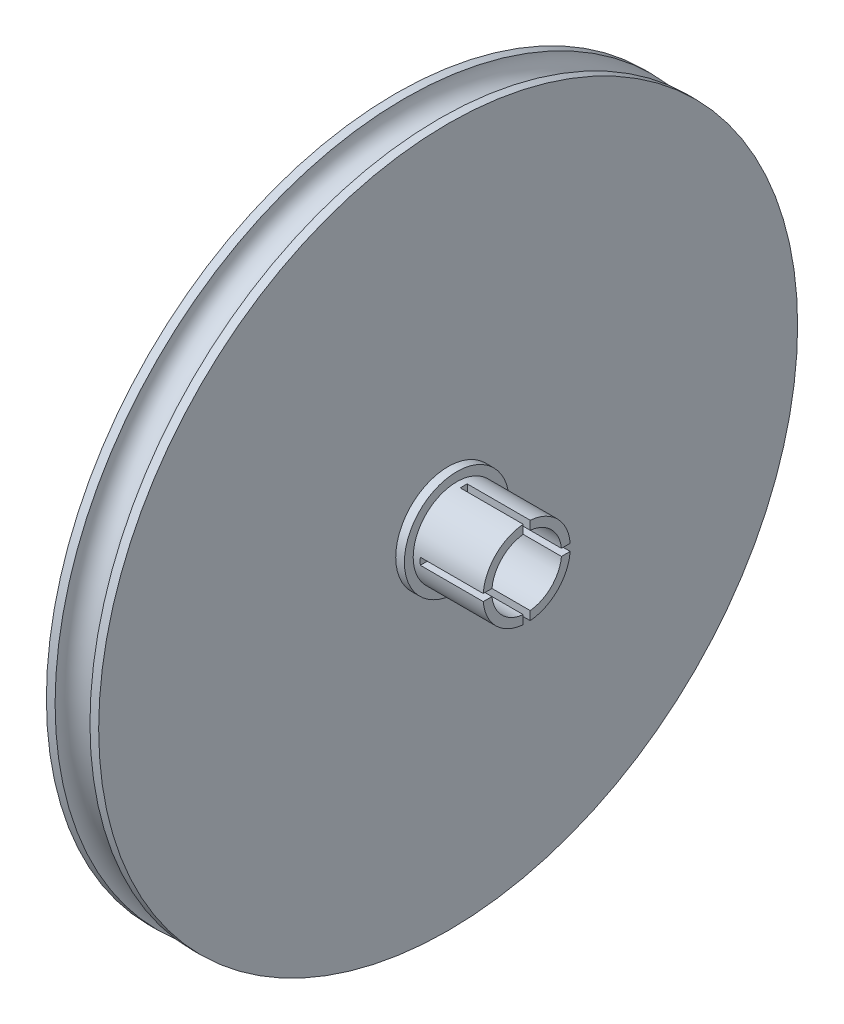
ISO-10303-21;
HEADER;
FILE_DESCRIPTION(('STEP AP214'),'2;1');
FILE_NAME('part.step','',(''),(''),'','','');
FILE_SCHEMA(('AUTOMOTIVE_DESIGN { 1 0 10303 214 1 1 1 1 }'));
ENDSEC;
DATA;
#1=APPLICATION_CONTEXT('core data for automotive mechanical design processes');
#2=APPLICATION_PROTOCOL_DEFINITION('international standard','automotive_design',2000,#1);
#3=PRODUCT_CONTEXT('',#1,'mechanical');
#4=PRODUCT('Part','Part','',(#3));
#5=PRODUCT_RELATED_PRODUCT_CATEGORY('part','',(#4));
#6=PRODUCT_DEFINITION_FORMATION('','',#4);
#7=PRODUCT_DEFINITION_CONTEXT('part definition',#1,'design');
#8=PRODUCT_DEFINITION('design','',#6,#7);
#9=PRODUCT_DEFINITION_SHAPE('','',#8);
#10=(LENGTH_UNIT() NAMED_UNIT(*) SI_UNIT(.MILLI.,.METRE.));
#11=(NAMED_UNIT(*) PLANE_ANGLE_UNIT() SI_UNIT($,.RADIAN.));
#12=(NAMED_UNIT(*) SI_UNIT($,.STERADIAN.) SOLID_ANGLE_UNIT());
#13=UNCERTAINTY_MEASURE_WITH_UNIT(LENGTH_MEASURE(1.E-05),#10,'distance_accuracy_value','');
#14=(GEOMETRIC_REPRESENTATION_CONTEXT(3) GLOBAL_UNCERTAINTY_ASSIGNED_CONTEXT((#13)) GLOBAL_UNIT_ASSIGNED_CONTEXT((#10,
#11,#12)) REPRESENTATION_CONTEXT('',''));
#15=CARTESIAN_POINT('',(0.,0.,0.));
#16=DIRECTION('',(0.,0.,1.));
#17=DIRECTION('',(1.,0.,0.));
#18=AXIS2_PLACEMENT_3D('',#15,#16,#17);
#19=CARTESIAN_POINT('',(11.8872,4.7625,0.));
#20=DIRECTION('',(-1.,0.,0.));
#21=DIRECTION('',(0.,0.,1.));
#22=AXIS2_PLACEMENT_3D('',#19,#20,#21);
#23=PLANE('',#22);
#24=CARTESIAN_POINT('',(11.8872,0.,0.));
#25=DIRECTION('',(-1.,0.,0.));
#26=DIRECTION('',(0.,0.,1.));
#27=AXIS2_PLACEMENT_3D('',#24,#25,#26);
#28=CIRCLE('',#27,3.9624);
#29=CARTESIAN_POINT('',(11.8872,-0.317499999999958,-3.94965916377604));
#30=VERTEX_POINT('',#29);
#31=CARTESIAN_POINT('',(11.8872,-3.94965916377603,-0.317500000000027));
#32=VERTEX_POINT('',#31);
#33=EDGE_CURVE('E259',#30,#32,#28,.T.);
#34=ORIENTED_EDGE('',*,*,#33,.F.);
#35=DIRECTION('',(0.,0.,-1.));
#36=VECTOR('',#35,1.);
#37=CARTESIAN_POINT('',(11.8872,-0.317499999999958,-3.94965916377604));
#38=LINE('',#37,#36);
#39=CARTESIAN_POINT('',(11.8872,-0.317499999999967,-3.15653230644009));
#40=VERTEX_POINT('',#39);
#41=EDGE_CURVE('E171',#40,#30,#38,.T.);
#42=ORIENTED_EDGE('',*,*,#41,.F.);
#43=CARTESIAN_POINT('',(11.8872,0.,0.));
#44=DIRECTION('',(-1.,0.,0.));
#45=DIRECTION('',(0.,0.,1.));
#46=AXIS2_PLACEMENT_3D('',#43,#44,#45);
#47=CIRCLE('',#46,3.17246);
#48=CARTESIAN_POINT('',(11.8872,-3.15653230644009,-0.317500000000022));
#49=VERTEX_POINT('',#48);
#50=EDGE_CURVE('E278',#40,#49,#47,.T.);
#51=ORIENTED_EDGE('',*,*,#50,.T.);
#52=DIRECTION('',(0.,1.,0.));
#53=VECTOR('',#52,1.);
#54=CARTESIAN_POINT('',(11.8872,-3.94965916377603,-0.317500000000027));
#55=LINE('',#54,#53);
#56=EDGE_CURVE('E189',#32,#49,#55,.T.);
#57=ORIENTED_EDGE('',*,*,#56,.F.);
#58=EDGE_LOOP('',(#34,#42,#51,#57));
#59=FACE_BOUND('',#58,.T.);
#60=ADVANCED_FACE('F33',(#59),#23,.F.);
#61=CARTESIAN_POINT('',(11.8872,-3.94965916377604,0.317499999999972));
#62=VERTEX_POINT('',#61);
#63=CARTESIAN_POINT('',(11.8872,-0.317500000000014,3.94965916377603));
#64=VERTEX_POINT('',#63);
#65=EDGE_CURVE('E314',#62,#64,#28,.T.);
#66=ORIENTED_EDGE('',*,*,#65,.F.);
#67=DIRECTION('',(0.,-1.,0.));
#68=VECTOR('',#67,1.);
#69=CARTESIAN_POINT('',(11.8872,-3.94965916377604,0.317499999999972));
#70=LINE('',#69,#68);
#71=CARTESIAN_POINT('',(11.8872,-3.15653230644009,0.317499999999978));
#72=VERTEX_POINT('',#71);
#73=EDGE_CURVE('E198',#72,#62,#70,.T.);
#74=ORIENTED_EDGE('',*,*,#73,.F.);
#75=CARTESIAN_POINT('',(11.8872,-0.317500000000011,3.15653230644009));
#76=VERTEX_POINT('',#75);
#77=EDGE_CURVE('E282',#72,#76,#47,.T.);
#78=ORIENTED_EDGE('',*,*,#77,.T.);
#79=DIRECTION('',(0.,0.,-1.));
#80=VECTOR('',#79,1.);
#81=CARTESIAN_POINT('',(11.8872,-0.317500000000014,3.94965916377603));
#82=LINE('',#81,#80);
#83=EDGE_CURVE('E212',#64,#76,#82,.T.);
#84=ORIENTED_EDGE('',*,*,#83,.F.);
#85=EDGE_LOOP('',(#66,#74,#78,#84));
#86=FACE_BOUND('',#85,.T.);
#87=ADVANCED_FACE('F292',(#86),#23,.F.);
#88=CARTESIAN_POINT('',(11.8872,0.317499999999986,3.94965916377604));
#89=VERTEX_POINT('',#88);
#90=CARTESIAN_POINT('',(11.8872,3.94965916377603,0.3175));
#91=VERTEX_POINT('',#90);
#92=EDGE_CURVE('E256',#89,#91,#28,.T.);
#93=ORIENTED_EDGE('',*,*,#92,.F.);
#94=DIRECTION('',(0.,0.,1.));
#95=VECTOR('',#94,1.);
#96=CARTESIAN_POINT('',(11.8872,0.317499999999986,3.94965916377604));
#97=LINE('',#96,#95);
#98=CARTESIAN_POINT('',(11.8872,0.317499999999989,3.15653230644009));
#99=VERTEX_POINT('',#98);
#100=EDGE_CURVE('E221',#99,#89,#97,.T.);
#101=ORIENTED_EDGE('',*,*,#100,.F.);
#102=CARTESIAN_POINT('',(11.8872,3.15653230644009,0.3175));
#103=VERTEX_POINT('',#102);
#104=EDGE_CURVE('E276',#99,#103,#47,.T.);
#105=ORIENTED_EDGE('',*,*,#104,.T.);
#106=DIRECTION('',(0.,-1.,0.));
#107=VECTOR('',#106,1.);
#108=CARTESIAN_POINT('',(11.8872,3.94965916377603,0.3175));
#109=LINE('',#108,#107);
#110=EDGE_CURVE('E228',#91,#103,#109,.T.);
#111=ORIENTED_EDGE('',*,*,#110,.F.);
#112=EDGE_LOOP('',(#93,#101,#105,#111));
#113=FACE_BOUND('',#112,.T.);
#114=ADVANCED_FACE('F313',(#113),#23,.F.);
#115=CARTESIAN_POINT('',(11.8872,3.15653230644009,-0.3175));
#116=VERTEX_POINT('',#115);
#117=CARTESIAN_POINT('',(11.8872,0.317500000000033,-3.15653230644009));
#118=VERTEX_POINT('',#117);
#119=EDGE_CURVE('E41',#116,#118,#47,.T.);
#120=ORIENTED_EDGE('',*,*,#119,.T.);
#121=DIRECTION('',(0.,0.,1.));
#122=VECTOR('',#121,1.);
#123=CARTESIAN_POINT('',(11.8872,0.317500000000041,-3.94965916377603));
#124=LINE('',#123,#122);
#125=CARTESIAN_POINT('',(11.8872,0.317500000000041,-3.94965916377603));
#126=VERTEX_POINT('',#125);
#127=EDGE_CURVE('E174',#126,#118,#124,.T.);
#128=ORIENTED_EDGE('',*,*,#127,.F.);
#129=CARTESIAN_POINT('',(11.8872,3.94965916377603,-0.3175));
#130=VERTEX_POINT('',#129);
#131=EDGE_CURVE('E170',#130,#126,#28,.T.);
#132=ORIENTED_EDGE('',*,*,#131,.F.);
#133=DIRECTION('',(0.,1.,0.));
#134=VECTOR('',#133,1.);
#135=CARTESIAN_POINT('',(11.8872,3.94965916377603,-0.3175));
#136=LINE('',#135,#134);
#137=EDGE_CURVE('E233',#116,#130,#136,.T.);
#138=ORIENTED_EDGE('',*,*,#137,.F.);
#139=EDGE_LOOP('',(#120,#128,#132,#138));
#140=FACE_BOUND('',#139,.T.);
#141=ADVANCED_FACE('F340',(#140),#23,.F.);
#142=CARTESIAN_POINT('',(0.,0.,0.));
#143=DIRECTION('',(-1.,0.,0.));
#144=DIRECTION('',(0.,0.,1.));
#145=AXIS2_PLACEMENT_3D('',#142,#143,#144);
#146=CYLINDRICAL_SURFACE('',#145,4.7625);
#147=CARTESIAN_POINT('',(4.7498,0.,0.));
#148=DIRECTION('',(-1.,0.,0.));
#149=DIRECTION('',(0.,0.,1.));
#150=AXIS2_PLACEMENT_3D('',#147,#148,#149);
#151=CIRCLE('',#150,4.7625);
#152=CARTESIAN_POINT('',(4.7498,0.,4.7625));
#153=VERTEX_POINT('',#152);
#154=EDGE_CURVE('E274',#153,#153,#151,.T.);
#155=ORIENTED_EDGE('',*,*,#154,.F.);
#156=EDGE_LOOP('',(#155));
#157=FACE_BOUND('',#156,.T.);
#158=CARTESIAN_POINT('',(5.5372,0.,0.));
#159=DIRECTION('',(-1.,0.,0.));
#160=DIRECTION('',(0.,0.,1.));
#161=AXIS2_PLACEMENT_3D('',#158,#159,#160);
#162=CIRCLE('',#161,4.7625);
#163=CARTESIAN_POINT('',(5.5372,0.,4.7625));
#164=VERTEX_POINT('',#163);
#165=EDGE_CURVE('E246',#164,#164,#162,.T.);
#166=ORIENTED_EDGE('',*,*,#165,.T.);
#167=EDGE_LOOP('',(#166));
#168=FACE_BOUND('',#167,.T.);
#169=ADVANCED_FACE('F346',(#157,#168),#146,.T.);
#170=CARTESIAN_POINT('',(0.,31.75,0.));
#171=DIRECTION('',(1.,0.,0.));
#172=DIRECTION('',(0.,0.,-1.));
#173=AXIS2_PLACEMENT_3D('',#170,#171,#172);
#174=PLANE('',#173);
#175=CARTESIAN_POINT('',(0.,0.,0.));
#176=DIRECTION('',(-1.,0.,0.));
#177=DIRECTION('',(0.,0.,1.));
#178=AXIS2_PLACEMENT_3D('',#175,#176,#177);
#179=CIRCLE('',#178,3.17246);
#180=CARTESIAN_POINT('',(0.,0.,3.17246));
#181=VERTEX_POINT('',#180);
#182=EDGE_CURVE('E11',#181,#181,#179,.T.);
#183=ORIENTED_EDGE('',*,*,#182,.F.);
#184=EDGE_LOOP('',(#183));
#185=FACE_BOUND('',#184,.T.);
#186=CARTESIAN_POINT('',(0.,0.,0.));
#187=DIRECTION('',(-1.,0.,0.));
#188=DIRECTION('',(0.,0.,1.));
#189=AXIS2_PLACEMENT_3D('',#186,#187,#188);
#190=CIRCLE('',#189,31.75);
#191=CARTESIAN_POINT('',(0.,0.,31.75));
#192=VERTEX_POINT('',#191);
#193=EDGE_CURVE('E262',#192,#192,#190,.T.);
#194=ORIENTED_EDGE('',*,*,#193,.T.);
#195=EDGE_LOOP('',(#194));
#196=FACE_BOUND('',#195,.T.);
#197=ADVANCED_FACE('F35',(#185,#196),#174,.F.);
#198=CARTESIAN_POINT('',(0.,0.,0.));
#199=DIRECTION('',(-1.,0.,0.));
#200=DIRECTION('',(0.,0.,1.));
#201=AXIS2_PLACEMENT_3D('',#198,#199,#200);
#202=CYLINDRICAL_SURFACE('',#201,3.17246);
#203=ORIENTED_EDGE('',*,*,#50,.F.);
#204=DIRECTION('',(1.,0.,0.));
#205=VECTOR('',#204,1.);
#206=CARTESIAN_POINT('',(6.1722,-0.317499999999967,-3.15653230644009));
#207=LINE('',#206,#205);
#208=CARTESIAN_POINT('',(6.1722,-0.317499999999967,-3.15653230644009));
#209=VERTEX_POINT('',#208);
#210=EDGE_CURVE('E179',#209,#40,#207,.T.);
#211=ORIENTED_EDGE('',*,*,#210,.F.);
#212=CARTESIAN_POINT('',(6.1722,0.,0.));
#213=DIRECTION('',(-1.,0.,0.));
#214=DIRECTION('',(0.,-1.,0.));
#215=AXIS2_PLACEMENT_3D('',#212,#213,#214);
#216=CIRCLE('',#215,3.17246);
#217=CARTESIAN_POINT('',(6.1722,0.317500000000033,-3.15653230644009));
#218=VERTEX_POINT('',#217);
#219=EDGE_CURVE('E163',#218,#209,#216,.T.);
#220=ORIENTED_EDGE('',*,*,#219,.F.);
#221=DIRECTION('',(1.,0.,0.));
#222=VECTOR('',#221,1.);
#223=CARTESIAN_POINT('',(6.1722,0.317500000000033,-3.15653230644009));
#224=LINE('',#223,#222);
#225=EDGE_CURVE('E161',#218,#118,#224,.T.);
#226=ORIENTED_EDGE('',*,*,#225,.T.);
#227=ORIENTED_EDGE('',*,*,#119,.F.);
#228=DIRECTION('',(1.,0.,0.));
#229=VECTOR('',#228,1.);
#230=CARTESIAN_POINT('',(6.1722,3.15653230644009,-0.3175));
#231=LINE('',#230,#229);
#232=CARTESIAN_POINT('',(6.1722,3.15653230644009,-0.3175));
#233=VERTEX_POINT('',#232);
#234=EDGE_CURVE('E247',#233,#116,#231,.T.);
#235=ORIENTED_EDGE('',*,*,#234,.F.);
#236=CARTESIAN_POINT('',(6.1722,0.,0.));
#237=DIRECTION('',(-1.,0.,0.));
#238=DIRECTION('',(0.,0.,-1.));
#239=AXIS2_PLACEMENT_3D('',#236,#237,#238);
#240=CIRCLE('',#239,3.17246);
#241=CARTESIAN_POINT('',(6.1722,3.15653230644009,0.3175));
#242=VERTEX_POINT('',#241);
#243=EDGE_CURVE('E236',#242,#233,#240,.T.);
#244=ORIENTED_EDGE('',*,*,#243,.F.);
#245=DIRECTION('',(1.,0.,0.));
#246=VECTOR('',#245,1.);
#247=CARTESIAN_POINT('',(6.1722,3.15653230644009,0.3175));
#248=LINE('',#247,#246);
#249=EDGE_CURVE('E249',#242,#103,#248,.T.);
#250=ORIENTED_EDGE('',*,*,#249,.T.);
#251=ORIENTED_EDGE('',*,*,#104,.F.);
#252=DIRECTION('',(1.,0.,0.));
#253=VECTOR('',#252,1.);
#254=CARTESIAN_POINT('',(6.1722,0.317499999999989,3.15653230644009));
#255=LINE('',#254,#253);
#256=CARTESIAN_POINT('',(6.1722,0.317499999999989,3.15653230644009));
#257=VERTEX_POINT('',#256);
#258=EDGE_CURVE('E226',#257,#99,#255,.T.);
#259=ORIENTED_EDGE('',*,*,#258,.F.);
#260=CARTESIAN_POINT('',(6.1722,0.,0.));
#261=DIRECTION('',(-1.,0.,0.));
#262=DIRECTION('',(0.,1.,0.));
#263=AXIS2_PLACEMENT_3D('',#260,#261,#262);
#264=CIRCLE('',#263,3.17246);
#265=CARTESIAN_POINT('',(6.1722,-0.317500000000011,3.15653230644009));
#266=VERTEX_POINT('',#265);
#267=EDGE_CURVE('E207',#266,#257,#264,.T.);
#268=ORIENTED_EDGE('',*,*,#267,.F.);
#269=DIRECTION('',(1.,0.,0.));
#270=VECTOR('',#269,1.);
#271=CARTESIAN_POINT('',(6.1722,-0.317500000000011,3.15653230644009));
#272=LINE('',#271,#270);
#273=EDGE_CURVE('E215',#266,#76,#272,.T.);
#274=ORIENTED_EDGE('',*,*,#273,.T.);
#275=ORIENTED_EDGE('',*,*,#77,.F.);
#276=DIRECTION('',(1.,0.,0.));
#277=VECTOR('',#276,1.);
#278=CARTESIAN_POINT('',(6.1722,-3.15653230644009,0.317499999999978));
#279=LINE('',#278,#277);
#280=CARTESIAN_POINT('',(6.1722,-3.15653230644009,0.317499999999978));
#281=VERTEX_POINT('',#280);
#282=EDGE_CURVE('E201',#281,#72,#279,.T.);
#283=ORIENTED_EDGE('',*,*,#282,.F.);
#284=CARTESIAN_POINT('',(6.1722,0.,0.));
#285=DIRECTION('',(-1.,0.,0.));
#286=DIRECTION('',(0.,0.,1.));
#287=AXIS2_PLACEMENT_3D('',#284,#285,#286);
#288=CIRCLE('',#287,3.17246);
#289=CARTESIAN_POINT('',(6.1722,-3.15653230644009,-0.317500000000022));
#290=VERTEX_POINT('',#289);
#291=EDGE_CURVE('E185',#290,#281,#288,.T.);
#292=ORIENTED_EDGE('',*,*,#291,.F.);
#293=DIRECTION('',(1.,0.,0.));
#294=VECTOR('',#293,1.);
#295=CARTESIAN_POINT('',(6.1722,-3.15653230644009,-0.317500000000022));
#296=LINE('',#295,#294);
#297=EDGE_CURVE('E192',#290,#49,#296,.T.);
#298=ORIENTED_EDGE('',*,*,#297,.T.);
#299=EDGE_LOOP('',(#203,#211,#220,#226,#227,#235,#244,#250,#251,#259,#268,#274,#275,#283,#292,#298));
#300=FACE_BOUND('',#299,.T.);
#301=ORIENTED_EDGE('',*,*,#182,.T.);
#302=EDGE_LOOP('',(#301));
#303=FACE_BOUND('',#302,.T.);
#304=ADVANCED_FACE('F302',(#300,#303),#202,.F.);
#305=CARTESIAN_POINT('',(4.7498,31.75,0.));
#306=DIRECTION('',(-1.,0.,0.));
#307=DIRECTION('',(0.,0.,1.));
#308=AXIS2_PLACEMENT_3D('',#305,#306,#307);
#309=PLANE('',#308);
#310=CARTESIAN_POINT('',(4.74979999999999,0.,0.));
#311=DIRECTION('',(-1.,0.,0.));
#312=DIRECTION('',(0.,0.,1.));
#313=AXIS2_PLACEMENT_3D('',#310,#311,#312);
#314=CIRCLE('',#313,31.75);
#315=CARTESIAN_POINT('',(4.74979999999999,0.,31.75));
#316=VERTEX_POINT('',#315);
#317=EDGE_CURVE('E271',#316,#316,#314,.T.);
#318=ORIENTED_EDGE('',*,*,#317,.F.);
#319=EDGE_LOOP('',(#318));
#320=FACE_BOUND('',#319,.T.);
#321=ORIENTED_EDGE('',*,*,#154,.T.);
#322=EDGE_LOOP('',(#321));
#323=FACE_BOUND('',#322,.T.);
#324=ADVANCED_FACE('F444',(#320,#323),#309,.F.);
#325=CARTESIAN_POINT('',(0.,0.,0.));
#326=DIRECTION('',(-1.,0.,0.));
#327=DIRECTION('',(0.,0.,1.));
#328=AXIS2_PLACEMENT_3D('',#325,#326,#327);
#329=CYLINDRICAL_SURFACE('',#328,31.75);
#330=CARTESIAN_POINT('',(3.95824582999999,0.,0.));
#331=DIRECTION('',(-1.,0.,0.));
#332=DIRECTION('',(0.,0.,1.));
#333=AXIS2_PLACEMENT_3D('',#330,#331,#332);
#334=CIRCLE('',#333,31.75);
#335=CARTESIAN_POINT('',(3.95824582999999,0.,31.75));
#336=VERTEX_POINT('',#335);
#337=EDGE_CURVE('E268',#336,#336,#334,.T.);
#338=ORIENTED_EDGE('',*,*,#337,.F.);
#339=EDGE_LOOP('',(#338));
#340=FACE_BOUND('',#339,.T.);
#341=ORIENTED_EDGE('',*,*,#317,.T.);
#342=EDGE_LOOP('',(#341));
#343=FACE_BOUND('',#342,.T.);
#344=ADVANCED_FACE('F434',(#340,#343),#329,.T.);
#345=CARTESIAN_POINT('',(2.3749,0.,0.));
#346=DIRECTION('',(-1.,0.,0.));
#347=DIRECTION('',(0.,0.,1.));
#348=AXIS2_PLACEMENT_3D('',#345,#346,#347);
#349=TOROIDAL_SURFACE('',#348,31.75,1.58334583);
#350=CARTESIAN_POINT('',(0.791554169999996,0.,0.));
#351=DIRECTION('',(-1.,0.,0.));
#352=DIRECTION('',(0.,0.,1.));
#353=AXIS2_PLACEMENT_3D('',#350,#351,#352);
#354=CIRCLE('',#353,31.75);
#355=CARTESIAN_POINT('',(0.791554169999996,0.,31.75));
#356=VERTEX_POINT('',#355);
#357=EDGE_CURVE('E265',#356,#356,#354,.T.);
#358=ORIENTED_EDGE('',*,*,#357,.F.);
#359=EDGE_LOOP('',(#358));
#360=FACE_BOUND('',#359,.T.);
#361=ORIENTED_EDGE('',*,*,#337,.T.);
#362=EDGE_LOOP('',(#361));
#363=FACE_BOUND('',#362,.T.);
#364=ADVANCED_FACE('F424',(#360,#363),#349,.F.);
#365=CARTESIAN_POINT('',(0.,0.,0.));
#366=DIRECTION('',(-1.,0.,0.));
#367=DIRECTION('',(0.,0.,1.));
#368=AXIS2_PLACEMENT_3D('',#365,#366,#367);
#369=CYLINDRICAL_SURFACE('',#368,31.75);
#370=ORIENTED_EDGE('',*,*,#193,.F.);
#371=EDGE_LOOP('',(#370));
#372=FACE_BOUND('',#371,.T.);
#373=ORIENTED_EDGE('',*,*,#357,.T.);
#374=EDGE_LOOP('',(#373));
#375=FACE_BOUND('',#374,.T.);
#376=ADVANCED_FACE('F406',(#372,#375),#369,.T.);
#377=CARTESIAN_POINT('',(5.5372,4.7625,0.));
#378=DIRECTION('',(1.,0.,0.));
#379=DIRECTION('',(0.,0.,-1.));
#380=AXIS2_PLACEMENT_3D('',#377,#378,#379);
#381=PLANE('',#380);
#382=CARTESIAN_POINT('',(5.5372,0.,0.));
#383=DIRECTION('',(-1.,0.,0.));
#384=DIRECTION('',(0.,0.,1.));
#385=AXIS2_PLACEMENT_3D('',#382,#383,#384);
#386=CIRCLE('',#385,3.9624);
#387=CARTESIAN_POINT('',(5.5372,0.,3.9624));
#388=VERTEX_POINT('',#387);
#389=EDGE_CURVE('E258',#388,#388,#386,.T.);
#390=ORIENTED_EDGE('',*,*,#389,.T.);
#391=EDGE_LOOP('',(#390));
#392=FACE_BOUND('',#391,.T.);
#393=ORIENTED_EDGE('',*,*,#165,.F.);
#394=EDGE_LOOP('',(#393));
#395=FACE_BOUND('',#394,.T.);
#396=ADVANCED_FACE('F401',(#392,#395),#381,.T.);
#397=CARTESIAN_POINT('',(0.,0.,0.));
#398=DIRECTION('',(-1.,0.,0.));
#399=DIRECTION('',(0.,0.,1.));
#400=AXIS2_PLACEMENT_3D('',#397,#398,#399);
#401=CYLINDRICAL_SURFACE('',#400,3.9624);
#402=DIRECTION('',(1.,0.,0.));
#403=VECTOR('',#402,1.);
#404=CARTESIAN_POINT('',(6.1722,-0.317499999999958,-3.94965916377604));
#405=LINE('',#404,#403);
#406=CARTESIAN_POINT('',(6.1722,-0.317499999999958,-3.94965916377604));
#407=VERTEX_POINT('',#406);
#408=EDGE_CURVE('E48',#407,#30,#405,.T.);
#409=ORIENTED_EDGE('',*,*,#408,.T.);
#410=ORIENTED_EDGE('',*,*,#33,.T.);
#411=DIRECTION('',(1.,0.,0.));
#412=VECTOR('',#411,1.);
#413=CARTESIAN_POINT('',(6.1722,-3.94965916377603,-0.317500000000027));
#414=LINE('',#413,#412);
#415=CARTESIAN_POINT('',(6.1722,-3.94965916377603,-0.317500000000027));
#416=VERTEX_POINT('',#415);
#417=EDGE_CURVE('E195',#416,#32,#414,.T.);
#418=ORIENTED_EDGE('',*,*,#417,.F.);
#419=CARTESIAN_POINT('',(6.1722,0.,0.));
#420=DIRECTION('',(1.,0.,0.));
#421=DIRECTION('',(0.,0.,1.));
#422=AXIS2_PLACEMENT_3D('',#419,#420,#421);
#423=CIRCLE('',#422,3.9624);
#424=CARTESIAN_POINT('',(6.1722,-3.94965916377604,0.317499999999972));
#425=VERTEX_POINT('',#424);
#426=EDGE_CURVE('E181',#425,#416,#423,.T.);
#427=ORIENTED_EDGE('',*,*,#426,.F.);
#428=DIRECTION('',(1.,0.,0.));
#429=VECTOR('',#428,1.);
#430=CARTESIAN_POINT('',(6.1722,-3.94965916377604,0.317499999999972));
#431=LINE('',#430,#429);
#432=EDGE_CURVE('E56',#425,#62,#431,.T.);
#433=ORIENTED_EDGE('',*,*,#432,.T.);
#434=ORIENTED_EDGE('',*,*,#65,.T.);
#435=DIRECTION('',(1.,0.,0.));
#436=VECTOR('',#435,1.);
#437=CARTESIAN_POINT('',(6.1722,-0.317500000000014,3.94965916377603));
#438=LINE('',#437,#436);
#439=CARTESIAN_POINT('',(6.1722,-0.317500000000014,3.94965916377603));
#440=VERTEX_POINT('',#439);
#441=EDGE_CURVE('E218',#440,#64,#438,.T.);
#442=ORIENTED_EDGE('',*,*,#441,.F.);
#443=CARTESIAN_POINT('',(6.1722,0.,0.));
#444=DIRECTION('',(1.,0.,0.));
#445=DIRECTION('',(0.,1.,0.));
#446=AXIS2_PLACEMENT_3D('',#443,#444,#445);
#447=CIRCLE('',#446,3.9624);
#448=CARTESIAN_POINT('',(6.1722,0.317499999999986,3.94965916377603));
#449=VERTEX_POINT('',#448);
#450=EDGE_CURVE('E203',#449,#440,#447,.T.);
#451=ORIENTED_EDGE('',*,*,#450,.F.);
#452=DIRECTION('',(1.,0.,0.));
#453=VECTOR('',#452,1.);
#454=CARTESIAN_POINT('',(6.1722,0.317499999999986,3.94965916377604));
#455=LINE('',#454,#453);
#456=EDGE_CURVE('E223',#449,#89,#455,.T.);
#457=ORIENTED_EDGE('',*,*,#456,.T.);
#458=ORIENTED_EDGE('',*,*,#92,.T.);
#459=DIRECTION('',(1.,0.,0.));
#460=VECTOR('',#459,1.);
#461=CARTESIAN_POINT('',(6.1722,3.94965916377603,0.3175));
#462=LINE('',#461,#460);
#463=CARTESIAN_POINT('',(6.1722,3.94965916377603,0.3175));
#464=VERTEX_POINT('',#463);
#465=EDGE_CURVE('E240',#464,#91,#462,.T.);
#466=ORIENTED_EDGE('',*,*,#465,.F.);
#467=CARTESIAN_POINT('',(6.1722,0.,0.));
#468=DIRECTION('',(1.,0.,0.));
#469=DIRECTION('',(0.,0.,-1.));
#470=AXIS2_PLACEMENT_3D('',#467,#468,#469);
#471=CIRCLE('',#470,3.9624);
#472=CARTESIAN_POINT('',(6.1722,3.94965916377603,-0.3175));
#473=VERTEX_POINT('',#472);
#474=EDGE_CURVE('E229',#473,#464,#471,.T.);
#475=ORIENTED_EDGE('',*,*,#474,.F.);
#476=DIRECTION('',(1.,0.,0.));
#477=VECTOR('',#476,1.);
#478=CARTESIAN_POINT('',(6.1722,3.94965916377603,-0.3175));
#479=LINE('',#478,#477);
#480=EDGE_CURVE('E244',#473,#130,#479,.T.);
#481=ORIENTED_EDGE('',*,*,#480,.T.);
#482=ORIENTED_EDGE('',*,*,#131,.T.);
#483=DIRECTION('',(1.,0.,0.));
#484=VECTOR('',#483,1.);
#485=CARTESIAN_POINT('',(6.1722,0.317500000000041,-3.94965916377603));
#486=LINE('',#485,#484);
#487=CARTESIAN_POINT('',(6.1722,0.317500000000041,-3.94965916377603));
#488=VERTEX_POINT('',#487);
#489=EDGE_CURVE('E158',#488,#126,#486,.T.);
#490=ORIENTED_EDGE('',*,*,#489,.F.);
#491=CARTESIAN_POINT('',(6.1722,0.,0.));
#492=DIRECTION('',(1.,0.,0.));
#493=DIRECTION('',(0.,-1.,0.));
#494=AXIS2_PLACEMENT_3D('',#491,#492,#493);
#495=CIRCLE('',#494,3.9624);
#496=EDGE_CURVE('E147',#407,#488,#495,.T.);
#497=ORIENTED_EDGE('',*,*,#496,.F.);
#498=EDGE_LOOP('',(#409,#410,#418,#427,#433,#434,#442,#451,#457,#458,#466,#475,#481,#482,#490,#497));
#499=FACE_BOUND('',#498,.T.);
#500=ORIENTED_EDGE('',*,*,#389,.F.);
#501=EDGE_LOOP('',(#500));
#502=FACE_BOUND('',#501,.T.);
#503=ADVANCED_FACE('F166',(#499,#502),#401,.T.);
#504=CARTESIAN_POINT('',(6.1722,3.94965916377603,-0.3175));
#505=DIRECTION('',(0.,0.,-1.));
#506=DIRECTION('',(0.,1.,0.));
#507=AXIS2_PLACEMENT_3D('',#504,#505,#506);
#508=PLANE('',#507);
#509=ORIENTED_EDGE('',*,*,#137,.T.);
#510=ORIENTED_EDGE('',*,*,#480,.F.);
#511=DIRECTION('',(0.,1.,0.));
#512=VECTOR('',#511,1.);
#513=CARTESIAN_POINT('',(6.1722,3.94965916377603,-0.3175));
#514=LINE('',#513,#512);
#515=EDGE_CURVE('E238',#233,#473,#514,.T.);
#516=ORIENTED_EDGE('',*,*,#515,.F.);
#517=ORIENTED_EDGE('',*,*,#234,.T.);
#518=EDGE_LOOP('',(#509,#510,#516,#517));
#519=FACE_BOUND('',#518,.T.);
#520=ADVANCED_FACE('F384',(#519),#508,.F.);
#521=CARTESIAN_POINT('',(6.1722,3.94965916377603,0.3175));
#522=DIRECTION('',(0.,0.,1.));
#523=DIRECTION('',(0.,-1.,0.));
#524=AXIS2_PLACEMENT_3D('',#521,#522,#523);
#525=PLANE('',#524);
#526=ORIENTED_EDGE('',*,*,#110,.T.);
#527=ORIENTED_EDGE('',*,*,#249,.F.);
#528=DIRECTION('',(0.,-1.,0.));
#529=VECTOR('',#528,1.);
#530=CARTESIAN_POINT('',(6.1722,3.94965916377603,0.3175));
#531=LINE('',#530,#529);
#532=EDGE_CURVE('E232',#464,#242,#531,.T.);
#533=ORIENTED_EDGE('',*,*,#532,.F.);
#534=ORIENTED_EDGE('',*,*,#465,.T.);
#535=EDGE_LOOP('',(#526,#527,#533,#534));
#536=FACE_BOUND('',#535,.T.);
#537=ADVANCED_FACE('F373',(#536),#525,.F.);
#538=CARTESIAN_POINT('',(6.1722,0.,0.));
#539=DIRECTION('',(1.,0.,0.));
#540=DIRECTION('',(0.,0.,-1.));
#541=AXIS2_PLACEMENT_3D('',#538,#539,#540);
#542=PLANE('',#541);
#543=ORIENTED_EDGE('',*,*,#474,.T.);
#544=ORIENTED_EDGE('',*,*,#532,.T.);
#545=ORIENTED_EDGE('',*,*,#243,.T.);
#546=ORIENTED_EDGE('',*,*,#515,.T.);
#547=EDGE_LOOP('',(#543,#544,#545,#546));
#548=FACE_BOUND('',#547,.T.);
#549=ADVANCED_FACE('F368',(#548),#542,.T.);
#550=CARTESIAN_POINT('',(6.1722,0.317499999999986,3.94965916377604));
#551=DIRECTION('',(0.,1.,0.));
#552=DIRECTION('',(0.,0.,1.));
#553=AXIS2_PLACEMENT_3D('',#550,#551,#552);
#554=PLANE('',#553);
#555=ORIENTED_EDGE('',*,*,#100,.T.);
#556=ORIENTED_EDGE('',*,*,#456,.F.);
#557=DIRECTION('',(0.,0.,1.));
#558=VECTOR('',#557,1.);
#559=CARTESIAN_POINT('',(6.1722,0.317499999999986,3.94965916377604));
#560=LINE('',#559,#558);
#561=EDGE_CURVE('E209',#257,#449,#560,.T.);
#562=ORIENTED_EDGE('',*,*,#561,.F.);
#563=ORIENTED_EDGE('',*,*,#258,.T.);
#564=EDGE_LOOP('',(#555,#556,#562,#563));
#565=FACE_BOUND('',#564,.T.);
#566=ADVANCED_FACE('F310',(#565),#554,.F.);
#567=CARTESIAN_POINT('',(6.1722,-0.317500000000014,3.94965916377603));
#568=DIRECTION('',(0.,-1.,0.));
#569=DIRECTION('',(0.,0.,-1.));
#570=AXIS2_PLACEMENT_3D('',#567,#568,#569);
#571=PLANE('',#570);
#572=ORIENTED_EDGE('',*,*,#83,.T.);
#573=ORIENTED_EDGE('',*,*,#273,.F.);
#574=DIRECTION('',(0.,0.,-1.));
#575=VECTOR('',#574,1.);
#576=CARTESIAN_POINT('',(6.1722,-0.317500000000014,3.94965916377603));
#577=LINE('',#576,#575);
#578=EDGE_CURVE('E205',#440,#266,#577,.T.);
#579=ORIENTED_EDGE('',*,*,#578,.F.);
#580=ORIENTED_EDGE('',*,*,#441,.T.);
#581=EDGE_LOOP('',(#572,#573,#579,#580));
#582=FACE_BOUND('',#581,.T.);
#583=ADVANCED_FACE('F297',(#582),#571,.F.);
#584=CARTESIAN_POINT('',(6.1722,0.,0.));
#585=DIRECTION('',(1.,0.,0.));
#586=DIRECTION('',(0.,1.,0.));
#587=AXIS2_PLACEMENT_3D('',#584,#585,#586);
#588=PLANE('',#587);
#589=ORIENTED_EDGE('',*,*,#450,.T.);
#590=ORIENTED_EDGE('',*,*,#578,.T.);
#591=ORIENTED_EDGE('',*,*,#267,.T.);
#592=ORIENTED_EDGE('',*,*,#561,.T.);
#593=EDGE_LOOP('',(#589,#590,#591,#592));
#594=FACE_BOUND('',#593,.T.);
#595=ADVANCED_FACE('F307',(#594),#588,.T.);
#596=CARTESIAN_POINT('',(6.1722,-3.94965916377604,0.317499999999972));
#597=DIRECTION('',(0.,0.,1.));
#598=DIRECTION('',(0.,-1.,0.));
#599=AXIS2_PLACEMENT_3D('',#596,#597,#598);
#600=PLANE('',#599);
#601=ORIENTED_EDGE('',*,*,#73,.T.);
#602=ORIENTED_EDGE('',*,*,#432,.F.);
#603=DIRECTION('',(0.,-1.,0.));
#604=VECTOR('',#603,1.);
#605=CARTESIAN_POINT('',(6.1722,-3.94965916377604,0.317499999999972));
#606=LINE('',#605,#604);
#607=EDGE_CURVE('E187',#281,#425,#606,.T.);
#608=ORIENTED_EDGE('',*,*,#607,.F.);
#609=ORIENTED_EDGE('',*,*,#282,.T.);
#610=EDGE_LOOP('',(#601,#602,#608,#609));
#611=FACE_BOUND('',#610,.T.);
#612=ADVANCED_FACE('F329',(#611),#600,.F.);
#613=CARTESIAN_POINT('',(6.1722,-3.94965916377603,-0.317500000000027));
#614=DIRECTION('',(0.,0.,-1.));
#615=DIRECTION('',(0.,1.,0.));
#616=AXIS2_PLACEMENT_3D('',#613,#614,#615);
#617=PLANE('',#616);
#618=ORIENTED_EDGE('',*,*,#56,.T.);
#619=ORIENTED_EDGE('',*,*,#297,.F.);
#620=DIRECTION('',(0.,1.,0.));
#621=VECTOR('',#620,1.);
#622=CARTESIAN_POINT('',(6.1722,-3.94965916377603,-0.317500000000027));
#623=LINE('',#622,#621);
#624=EDGE_CURVE('E183',#416,#290,#623,.T.);
#625=ORIENTED_EDGE('',*,*,#624,.F.);
#626=ORIENTED_EDGE('',*,*,#417,.T.);
#627=EDGE_LOOP('',(#618,#619,#625,#626));
#628=FACE_BOUND('',#627,.T.);
#629=ADVANCED_FACE('F323',(#628),#617,.F.);
#630=CARTESIAN_POINT('',(6.1722,0.,0.));
#631=DIRECTION('',(1.,0.,0.));
#632=DIRECTION('',(0.,0.,1.));
#633=AXIS2_PLACEMENT_3D('',#630,#631,#632);
#634=PLANE('',#633);
#635=ORIENTED_EDGE('',*,*,#426,.T.);
#636=ORIENTED_EDGE('',*,*,#624,.T.);
#637=ORIENTED_EDGE('',*,*,#291,.T.);
#638=ORIENTED_EDGE('',*,*,#607,.T.);
#639=EDGE_LOOP('',(#635,#636,#637,#638));
#640=FACE_BOUND('',#639,.T.);
#641=ADVANCED_FACE('F328',(#640),#634,.T.);
#642=CARTESIAN_POINT('',(6.1722,-0.317499999999958,-3.94965916377604));
#643=DIRECTION('',(0.,-1.,0.));
#644=DIRECTION('',(0.,0.,-1.));
#645=AXIS2_PLACEMENT_3D('',#642,#643,#644);
#646=PLANE('',#645);
#647=ORIENTED_EDGE('',*,*,#41,.T.);
#648=ORIENTED_EDGE('',*,*,#408,.F.);
#649=DIRECTION('',(0.,0.,-1.));
#650=VECTOR('',#649,1.);
#651=CARTESIAN_POINT('',(6.1722,-0.317499999999958,-3.94965916377604));
#652=LINE('',#651,#650);
#653=EDGE_CURVE('E152',#209,#407,#652,.T.);
#654=ORIENTED_EDGE('',*,*,#653,.F.);
#655=ORIENTED_EDGE('',*,*,#210,.T.);
#656=EDGE_LOOP('',(#647,#648,#654,#655));
#657=FACE_BOUND('',#656,.T.);
#658=ADVANCED_FACE('F514',(#657),#646,.F.);
#659=CARTESIAN_POINT('',(6.1722,0.317500000000041,-3.94965916377603));
#660=DIRECTION('',(0.,1.,0.));
#661=DIRECTION('',(0.,0.,1.));
#662=AXIS2_PLACEMENT_3D('',#659,#660,#661);
#663=PLANE('',#662);
#664=ORIENTED_EDGE('',*,*,#127,.T.);
#665=ORIENTED_EDGE('',*,*,#225,.F.);
#666=DIRECTION('',(0.,0.,1.));
#667=VECTOR('',#666,1.);
#668=CARTESIAN_POINT('',(6.1722,0.317500000000041,-3.94965916377603));
#669=LINE('',#668,#667);
#670=EDGE_CURVE('E150',#488,#218,#669,.T.);
#671=ORIENTED_EDGE('',*,*,#670,.F.);
#672=ORIENTED_EDGE('',*,*,#489,.T.);
#673=EDGE_LOOP('',(#664,#665,#671,#672));
#674=FACE_BOUND('',#673,.T.);
#675=ADVANCED_FACE('F157',(#674),#663,.F.);
#676=CARTESIAN_POINT('',(6.1722,0.,0.));
#677=DIRECTION('',(1.,0.,0.));
#678=DIRECTION('',(0.,-1.,0.));
#679=AXIS2_PLACEMENT_3D('',#676,#677,#678);
#680=PLANE('',#679);
#681=ORIENTED_EDGE('',*,*,#496,.T.);
#682=ORIENTED_EDGE('',*,*,#670,.T.);
#683=ORIENTED_EDGE('',*,*,#219,.T.);
#684=ORIENTED_EDGE('',*,*,#653,.T.);
#685=EDGE_LOOP('',(#681,#682,#683,#684));
#686=FACE_BOUND('',#685,.T.);
#687=ADVANCED_FACE('F149',(#686),#680,.T.);
#688=CLOSED_SHELL('',(#60,#87,#114,#141,#169,#197,#304,#324,#344,#364,#376,#396,#503,#520,#537,
#549,#566,#583,#595,#612,#629,#641,#658,#675,#687));
#689=MANIFOLD_SOLID_BREP('B2',#688);
#690=ADVANCED_BREP_SHAPE_REPRESENTATION('',(#18,#689),#14);
#691=SHAPE_DEFINITION_REPRESENTATION(#9,#690);
ENDSEC;
END-ISO-10303-21;
